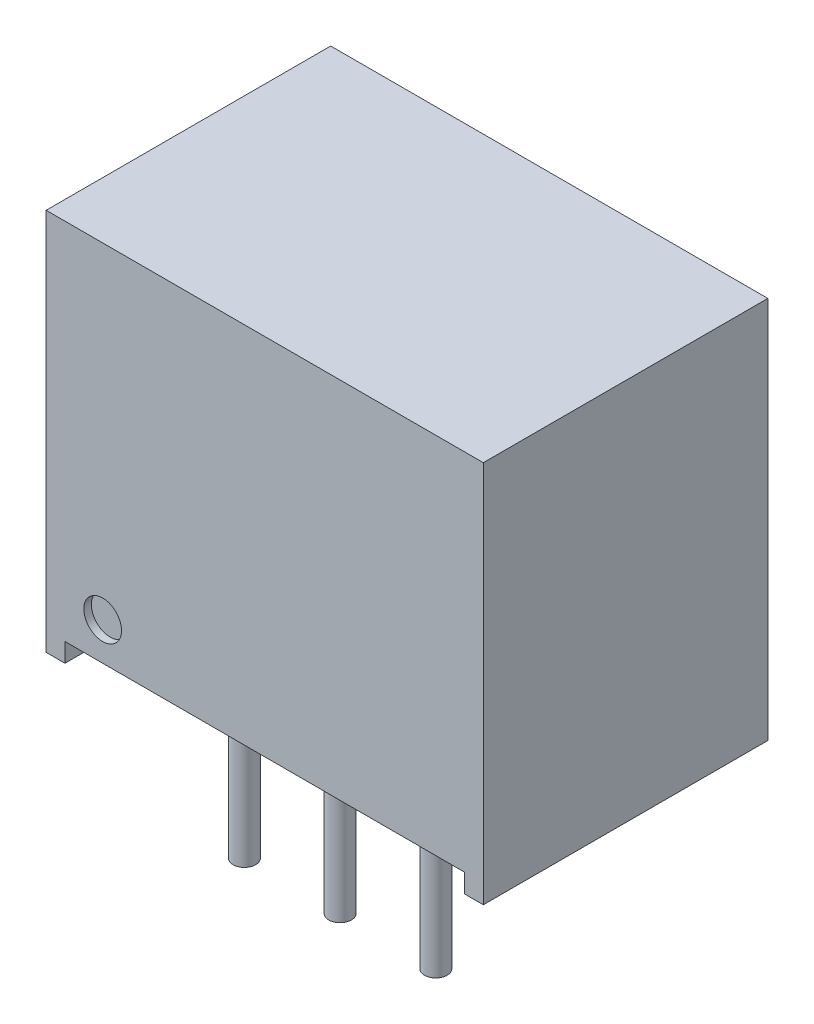
ISO-10303-21;
HEADER;
FILE_DESCRIPTION(('STEP AP214'),'2;1');
FILE_NAME('part.step','',(''),(''),'','','');
FILE_SCHEMA(('AUTOMOTIVE_DESIGN { 1 0 10303 214 1 1 1 1 }'));
ENDSEC;
DATA;
#1=APPLICATION_CONTEXT('core data for automotive mechanical design processes');
#2=APPLICATION_PROTOCOL_DEFINITION('international standard','automotive_design',2000,#1);
#3=PRODUCT_CONTEXT('',#1,'mechanical');
#4=PRODUCT('Part','Part','',(#3));
#5=PRODUCT_RELATED_PRODUCT_CATEGORY('part','',(#4));
#6=PRODUCT_DEFINITION_FORMATION('','',#4);
#7=PRODUCT_DEFINITION_CONTEXT('part definition',#1,'design');
#8=PRODUCT_DEFINITION('design','',#6,#7);
#9=PRODUCT_DEFINITION_SHAPE('','',#8);
#10=(LENGTH_UNIT() NAMED_UNIT(*) SI_UNIT(.MILLI.,.METRE.));
#11=(NAMED_UNIT(*) PLANE_ANGLE_UNIT() SI_UNIT($,.RADIAN.));
#12=(NAMED_UNIT(*) SI_UNIT($,.STERADIAN.) SOLID_ANGLE_UNIT());
#13=UNCERTAINTY_MEASURE_WITH_UNIT(LENGTH_MEASURE(1.E-05),#10,'distance_accuracy_value','');
#14=(GEOMETRIC_REPRESENTATION_CONTEXT(3) GLOBAL_UNCERTAINTY_ASSIGNED_CONTEXT((#13)) GLOBAL_UNIT_ASSIGNED_CONTEXT((#10,
#11,#12)) REPRESENTATION_CONTEXT('',''));
#15=CARTESIAN_POINT('',(0.,0.,0.));
#16=DIRECTION('',(0.,0.,1.));
#17=DIRECTION('',(1.,0.,0.));
#18=AXIS2_PLACEMENT_3D('',#15,#16,#17);
#19=CARTESIAN_POINT('',(0.,0.,0.));
#20=DIRECTION('',(0.,-1.,0.));
#21=DIRECTION('',(0.,0.,-1.));
#22=AXIS2_PLACEMENT_3D('',#19,#20,#21);
#23=PLANE('',#22);
#24=DIRECTION('',(1.,0.,0.));
#25=VECTOR('',#24,1.);
#26=CARTESIAN_POINT('',(0.,0.,0.));
#27=LINE('',#26,#25);
#28=CARTESIAN_POINT('',(11.1,0.,0.));
#29=VERTEX_POINT('',#28);
#30=CARTESIAN_POINT('',(11.6,0.,0.));
#31=VERTEX_POINT('',#30);
#32=EDGE_CURVE('E458',#29,#31,#27,.T.);
#33=ORIENTED_EDGE('',*,*,#32,.F.);
#34=DIRECTION('',(0.,0.,-1.));
#35=VECTOR('',#34,1.);
#36=CARTESIAN_POINT('',(11.1,0.,0.));
#37=LINE('',#36,#35);
#38=CARTESIAN_POINT('',(11.1,0.,-7.55));
#39=VERTEX_POINT('',#38);
#40=EDGE_CURVE('E475',#29,#39,#37,.T.);
#41=ORIENTED_EDGE('',*,*,#40,.T.);
#42=DIRECTION('',(-1.,0.,0.));
#43=VECTOR('',#42,1.);
#44=CARTESIAN_POINT('',(0.,0.,-7.55));
#45=LINE('',#44,#43);
#46=CARTESIAN_POINT('',(11.6,0.,-7.55));
#47=VERTEX_POINT('',#46);
#48=EDGE_CURVE('E425',#47,#39,#45,.T.);
#49=ORIENTED_EDGE('',*,*,#48,.F.);
#50=DIRECTION('',(0.,0.,-1.));
#51=VECTOR('',#50,1.);
#52=CARTESIAN_POINT('',(11.6,0.,0.));
#53=LINE('',#52,#51);
#54=EDGE_CURVE('E462',#31,#47,#53,.T.);
#55=ORIENTED_EDGE('',*,*,#54,.F.);
#56=EDGE_LOOP('',(#33,#41,#49,#55));
#57=FACE_BOUND('',#56,.T.);
#58=ADVANCED_FACE('F331',(#57),#23,.T.);
#59=CARTESIAN_POINT('',(0.,10.16,0.));
#60=DIRECTION('',(1.,0.,0.));
#61=DIRECTION('',(0.,0.,-1.));
#62=AXIS2_PLACEMENT_3D('',#59,#60,#61);
#63=PLANE('',#62);
#64=DIRECTION('',(0.,0.,1.));
#65=VECTOR('',#64,1.);
#66=CARTESIAN_POINT('',(0.,0.,0.));
#67=LINE('',#66,#65);
#68=CARTESIAN_POINT('',(0.,0.,-7.55));
#69=VERTEX_POINT('',#68);
#70=CARTESIAN_POINT('',(0.,0.,0.));
#71=VERTEX_POINT('',#70);
#72=EDGE_CURVE('E446',#69,#71,#67,.T.);
#73=ORIENTED_EDGE('',*,*,#72,.T.);
#74=DIRECTION('',(0.,-1.,0.));
#75=VECTOR('',#74,1.);
#76=CARTESIAN_POINT('',(0.,10.16,0.));
#77=LINE('',#76,#75);
#78=CARTESIAN_POINT('',(0.,10.16,0.));
#79=VERTEX_POINT('',#78);
#80=EDGE_CURVE('E12',#79,#71,#77,.T.);
#81=ORIENTED_EDGE('',*,*,#80,.F.);
#82=DIRECTION('',(0.,0.,1.));
#83=VECTOR('',#82,1.);
#84=CARTESIAN_POINT('',(0.,10.16,0.));
#85=LINE('',#84,#83);
#86=CARTESIAN_POINT('',(0.,10.16,-7.55));
#87=VERTEX_POINT('',#86);
#88=EDGE_CURVE('E449',#87,#79,#85,.T.);
#89=ORIENTED_EDGE('',*,*,#88,.F.);
#90=DIRECTION('',(0.,-1.,0.));
#91=VECTOR('',#90,1.);
#92=CARTESIAN_POINT('',(0.,10.16,-7.55));
#93=LINE('',#92,#91);
#94=EDGE_CURVE('E455',#87,#69,#93,.T.);
#95=ORIENTED_EDGE('',*,*,#94,.T.);
#96=EDGE_LOOP('',(#73,#81,#89,#95));
#97=FACE_BOUND('',#96,.T.);
#98=ADVANCED_FACE('F333',(#97),#63,.F.);
#99=CARTESIAN_POINT('',(0.,10.16,0.));
#100=DIRECTION('',(0.,0.,-1.));
#101=DIRECTION('',(-1.,0.,0.));
#102=AXIS2_PLACEMENT_3D('',#99,#100,#101);
#103=PLANE('',#102);
#104=CARTESIAN_POINT('',(1.5,1.5,0.));
#105=DIRECTION('',(0.,0.,1.));
#106=DIRECTION('',(1.,0.,0.));
#107=AXIS2_PLACEMENT_3D('',#104,#105,#106);
#108=CIRCLE('',#107,0.5);
#109=CARTESIAN_POINT('',(2.,1.5,0.));
#110=VERTEX_POINT('',#109);
#111=EDGE_CURVE('E442',#110,#110,#108,.T.);
#112=ORIENTED_EDGE('',*,*,#111,.F.);
#113=EDGE_LOOP('',(#112));
#114=FACE_BOUND('',#113,.T.);
#115=CARTESIAN_POINT('',(0.500000000000001,0.,0.));
#116=VERTEX_POINT('',#115);
#117=EDGE_CURVE('E459',#71,#116,#27,.T.);
#118=ORIENTED_EDGE('',*,*,#117,.T.);
#119=DIRECTION('',(0.,-1.,0.));
#120=VECTOR('',#119,1.);
#121=CARTESIAN_POINT('',(0.500000000000001,0.5,0.));
#122=LINE('',#121,#120);
#123=CARTESIAN_POINT('',(0.500000000000001,0.5,0.));
#124=VERTEX_POINT('',#123);
#125=EDGE_CURVE('E427',#124,#116,#122,.T.);
#126=ORIENTED_EDGE('',*,*,#125,.F.);
#127=DIRECTION('',(-1.,0.,0.));
#128=VECTOR('',#127,1.);
#129=CARTESIAN_POINT('',(0.,0.5,0.));
#130=LINE('',#129,#128);
#131=CARTESIAN_POINT('',(11.1,0.5,0.));
#132=VERTEX_POINT('',#131);
#133=EDGE_CURVE('E410',#132,#124,#130,.T.);
#134=ORIENTED_EDGE('',*,*,#133,.F.);
#135=DIRECTION('',(0.,-1.,0.));
#136=VECTOR('',#135,1.);
#137=CARTESIAN_POINT('',(11.1,0.5,0.));
#138=LINE('',#137,#136);
#139=EDGE_CURVE('E407',#132,#29,#138,.T.);
#140=ORIENTED_EDGE('',*,*,#139,.T.);
#141=ORIENTED_EDGE('',*,*,#32,.T.);
#142=DIRECTION('',(0.,-1.,0.));
#143=VECTOR('',#142,1.);
#144=CARTESIAN_POINT('',(11.6,10.16,0.));
#145=LINE('',#144,#143);
#146=CARTESIAN_POINT('',(11.6,10.16,0.));
#147=VERTEX_POINT('',#146);
#148=EDGE_CURVE('E339',#147,#31,#145,.T.);
#149=ORIENTED_EDGE('',*,*,#148,.F.);
#150=DIRECTION('',(1.,0.,0.));
#151=VECTOR('',#150,1.);
#152=CARTESIAN_POINT('',(0.,10.16,0.));
#153=LINE('',#152,#151);
#154=EDGE_CURVE('E383',#79,#147,#153,.T.);
#155=ORIENTED_EDGE('',*,*,#154,.F.);
#156=ORIENTED_EDGE('',*,*,#80,.T.);
#157=EDGE_LOOP('',(#118,#126,#134,#140,#141,#149,#155,#156));
#158=FACE_BOUND('',#157,.T.);
#159=ADVANCED_FACE('F491',(#114,#158),#103,.F.);
#160=CARTESIAN_POINT('',(11.6,10.16,0.));
#161=DIRECTION('',(-1.,0.,0.));
#162=DIRECTION('',(0.,0.,1.));
#163=AXIS2_PLACEMENT_3D('',#160,#161,#162);
#164=PLANE('',#163);
#165=ORIENTED_EDGE('',*,*,#54,.T.);
#166=DIRECTION('',(0.,-1.,0.));
#167=VECTOR('',#166,1.);
#168=CARTESIAN_POINT('',(11.6,10.16,-7.55));
#169=LINE('',#168,#167);
#170=CARTESIAN_POINT('',(11.6,10.16,-7.55));
#171=VERTEX_POINT('',#170);
#172=EDGE_CURVE('E466',#171,#47,#169,.T.);
#173=ORIENTED_EDGE('',*,*,#172,.F.);
#174=DIRECTION('',(0.,0.,-1.));
#175=VECTOR('',#174,1.);
#176=CARTESIAN_POINT('',(11.6,10.16,0.));
#177=LINE('',#176,#175);
#178=EDGE_CURVE('E452',#147,#171,#177,.T.);
#179=ORIENTED_EDGE('',*,*,#178,.F.);
#180=ORIENTED_EDGE('',*,*,#148,.T.);
#181=EDGE_LOOP('',(#165,#173,#179,#180));
#182=FACE_BOUND('',#181,.T.);
#183=ADVANCED_FACE('F471',(#182),#164,.F.);
#184=CARTESIAN_POINT('',(0.,10.16,-7.55));
#185=DIRECTION('',(0.,0.,1.));
#186=DIRECTION('',(1.,0.,0.));
#187=AXIS2_PLACEMENT_3D('',#184,#185,#186);
#188=PLANE('',#187);
#189=DIRECTION('',(1.,0.,0.));
#190=VECTOR('',#189,1.);
#191=CARTESIAN_POINT('',(0.,0.5,-7.55));
#192=LINE('',#191,#190);
#193=CARTESIAN_POINT('',(0.500000000000001,0.5,-7.55));
#194=VERTEX_POINT('',#193);
#195=CARTESIAN_POINT('',(11.1,0.5,-7.55));
#196=VERTEX_POINT('',#195);
#197=EDGE_CURVE('E411',#194,#196,#192,.T.);
#198=ORIENTED_EDGE('',*,*,#197,.F.);
#199=DIRECTION('',(0.,-1.,0.));
#200=VECTOR('',#199,1.);
#201=CARTESIAN_POINT('',(0.500000000000001,0.5,-7.55));
#202=LINE('',#201,#200);
#203=CARTESIAN_POINT('',(0.500000000000001,0.,-7.55));
#204=VERTEX_POINT('',#203);
#205=EDGE_CURVE('E436',#194,#204,#202,.T.);
#206=ORIENTED_EDGE('',*,*,#205,.T.);
#207=EDGE_CURVE('E376',#204,#69,#45,.T.);
#208=ORIENTED_EDGE('',*,*,#207,.T.);
#209=ORIENTED_EDGE('',*,*,#94,.F.);
#210=DIRECTION('',(-1.,0.,0.));
#211=VECTOR('',#210,1.);
#212=CARTESIAN_POINT('',(0.,10.16,-7.55));
#213=LINE('',#212,#211);
#214=EDGE_CURVE('E355',#171,#87,#213,.T.);
#215=ORIENTED_EDGE('',*,*,#214,.F.);
#216=ORIENTED_EDGE('',*,*,#172,.T.);
#217=ORIENTED_EDGE('',*,*,#48,.T.);
#218=DIRECTION('',(0.,-1.,0.));
#219=VECTOR('',#218,1.);
#220=CARTESIAN_POINT('',(11.1,0.5,-7.55));
#221=LINE('',#220,#219);
#222=EDGE_CURVE('E346',#196,#39,#221,.T.);
#223=ORIENTED_EDGE('',*,*,#222,.F.);
#224=EDGE_LOOP('',(#198,#206,#208,#209,#215,#216,#217,#223));
#225=FACE_BOUND('',#224,.T.);
#226=ADVANCED_FACE('F422',(#225),#188,.F.);
#227=CARTESIAN_POINT('',(0.,10.16,0.));
#228=DIRECTION('',(0.,-1.,0.));
#229=DIRECTION('',(0.,0.,-1.));
#230=AXIS2_PLACEMENT_3D('',#227,#228,#229);
#231=PLANE('',#230);
#232=ORIENTED_EDGE('',*,*,#88,.T.);
#233=ORIENTED_EDGE('',*,*,#154,.T.);
#234=ORIENTED_EDGE('',*,*,#178,.T.);
#235=ORIENTED_EDGE('',*,*,#214,.T.);
#236=EDGE_LOOP('',(#232,#233,#234,#235));
#237=FACE_BOUND('',#236,.T.);
#238=ADVANCED_FACE('F495',(#237),#231,.F.);
#239=DIRECTION('',(0.,0.,-1.));
#240=VECTOR('',#239,1.);
#241=CARTESIAN_POINT('',(0.5,0.,0.));
#242=LINE('',#241,#240);
#243=EDGE_CURVE('E419',#116,#204,#242,.T.);
#244=ORIENTED_EDGE('',*,*,#243,.F.);
#245=ORIENTED_EDGE('',*,*,#117,.F.);
#246=ORIENTED_EDGE('',*,*,#72,.F.);
#247=ORIENTED_EDGE('',*,*,#207,.F.);
#248=EDGE_LOOP('',(#244,#245,#246,#247));
#249=FACE_BOUND('',#248,.T.);
#250=ADVANCED_FACE('F489',(#249),#23,.T.);
#251=CARTESIAN_POINT('',(1.5,1.5,-0.2));
#252=DIRECTION('',(0.,0.,1.));
#253=DIRECTION('',(1.,0.,0.));
#254=AXIS2_PLACEMENT_3D('',#251,#252,#253);
#255=CYLINDRICAL_SURFACE('',#254,0.5);
#256=CARTESIAN_POINT('',(1.5,1.5,-0.2));
#257=DIRECTION('',(0.,0.,1.));
#258=DIRECTION('',(1.,0.,0.));
#259=AXIS2_PLACEMENT_3D('',#256,#257,#258);
#260=CIRCLE('',#259,0.5);
#261=CARTESIAN_POINT('',(2.,1.5,-0.2));
#262=VERTEX_POINT('',#261);
#263=EDGE_CURVE('E443',#262,#262,#260,.T.);
#264=ORIENTED_EDGE('',*,*,#263,.F.);
#265=EDGE_LOOP('',(#264));
#266=FACE_BOUND('',#265,.T.);
#267=ORIENTED_EDGE('',*,*,#111,.T.);
#268=EDGE_LOOP('',(#267));
#269=FACE_BOUND('',#268,.T.);
#270=ADVANCED_FACE('F502',(#266,#269),#255,.F.);
#271=CARTESIAN_POINT('',(1.5,1.5,-0.2));
#272=DIRECTION('',(0.,0.,1.));
#273=DIRECTION('',(1.,0.,0.));
#274=AXIS2_PLACEMENT_3D('',#271,#272,#273);
#275=PLANE('',#274);
#276=ORIENTED_EDGE('',*,*,#263,.T.);
#277=EDGE_LOOP('',(#276));
#278=FACE_BOUND('',#277,.T.);
#279=ADVANCED_FACE('F519',(#278),#275,.T.);
#280=CARTESIAN_POINT('',(0.,0.5,0.));
#281=DIRECTION('',(0.,1.,0.));
#282=DIRECTION('',(0.,0.,1.));
#283=AXIS2_PLACEMENT_3D('',#280,#281,#282);
#284=PLANE('',#283);
#285=CARTESIAN_POINT('',(5.8,0.5,-2.));
#286=DIRECTION('',(0.,-1.,0.));
#287=DIRECTION('',(0.,0.,-1.));
#288=AXIS2_PLACEMENT_3D('',#285,#286,#287);
#289=CIRCLE('',#288,0.3);
#290=CARTESIAN_POINT('',(5.8,0.5,-2.3));
#291=VERTEX_POINT('',#290);
#292=EDGE_CURVE('E480',#291,#291,#289,.F.);
#293=ORIENTED_EDGE('',*,*,#292,.T.);
#294=EDGE_LOOP('',(#293));
#295=FACE_BOUND('',#294,.T.);
#296=ORIENTED_EDGE('',*,*,#197,.T.);
#297=DIRECTION('',(0.,0.,-1.));
#298=VECTOR('',#297,1.);
#299=CARTESIAN_POINT('',(11.1,0.5,0.));
#300=LINE('',#299,#298);
#301=EDGE_CURVE('E403',#132,#196,#300,.T.);
#302=ORIENTED_EDGE('',*,*,#301,.F.);
#303=ORIENTED_EDGE('',*,*,#133,.T.);
#304=DIRECTION('',(0.,0.,-1.));
#305=VECTOR('',#304,1.);
#306=CARTESIAN_POINT('',(0.5,0.5,0.));
#307=LINE('',#306,#305);
#308=EDGE_CURVE('E418',#124,#194,#307,.T.);
#309=ORIENTED_EDGE('',*,*,#308,.T.);
#310=EDGE_LOOP('',(#296,#302,#303,#309));
#311=FACE_BOUND('',#310,.T.);
#312=CARTESIAN_POINT('',(8.34,0.5,-2.));
#313=DIRECTION('',(0.,-1.,0.));
#314=DIRECTION('',(0.,0.,-1.));
#315=AXIS2_PLACEMENT_3D('',#312,#313,#314);
#316=CIRCLE('',#315,0.3);
#317=CARTESIAN_POINT('',(8.34,0.5,-2.3));
#318=VERTEX_POINT('',#317);
#319=EDGE_CURVE('E476',#318,#318,#316,.F.);
#320=ORIENTED_EDGE('',*,*,#319,.T.);
#321=EDGE_LOOP('',(#320));
#322=FACE_BOUND('',#321,.T.);
#323=CARTESIAN_POINT('',(3.26,0.5,-2.));
#324=DIRECTION('',(0.,-1.,0.));
#325=DIRECTION('',(0.,0.,-1.));
#326=AXIS2_PLACEMENT_3D('',#323,#324,#325);
#327=CIRCLE('',#326,0.300000000000006);
#328=CARTESIAN_POINT('',(3.26,0.5,-2.30000000000001));
#329=VERTEX_POINT('',#328);
#330=EDGE_CURVE('E563',#329,#329,#327,.F.);
#331=ORIENTED_EDGE('',*,*,#330,.T.);
#332=EDGE_LOOP('',(#331));
#333=FACE_BOUND('',#332,.T.);
#334=ADVANCED_FACE('F415',(#295,#311,#322,#333),#284,.F.);
#335=CARTESIAN_POINT('',(0.5,0.5,0.));
#336=DIRECTION('',(-1.,0.,0.));
#337=DIRECTION('',(0.,0.,1.));
#338=AXIS2_PLACEMENT_3D('',#335,#336,#337);
#339=PLANE('',#338);
#340=ORIENTED_EDGE('',*,*,#243,.T.);
#341=ORIENTED_EDGE('',*,*,#205,.F.);
#342=ORIENTED_EDGE('',*,*,#308,.F.);
#343=ORIENTED_EDGE('',*,*,#125,.T.);
#344=EDGE_LOOP('',(#340,#341,#342,#343));
#345=FACE_BOUND('',#344,.T.);
#346=ADVANCED_FACE('F487',(#345),#339,.F.);
#347=CARTESIAN_POINT('',(11.1,0.5,0.));
#348=DIRECTION('',(-1.,0.,0.));
#349=DIRECTION('',(0.,0.,1.));
#350=AXIS2_PLACEMENT_3D('',#347,#348,#349);
#351=PLANE('',#350);
#352=ORIENTED_EDGE('',*,*,#40,.F.);
#353=ORIENTED_EDGE('',*,*,#139,.F.);
#354=ORIENTED_EDGE('',*,*,#301,.T.);
#355=ORIENTED_EDGE('',*,*,#222,.T.);
#356=EDGE_LOOP('',(#352,#353,#354,#355));
#357=FACE_BOUND('',#356,.T.);
#358=ADVANCED_FACE('F405',(#357),#351,.T.);
#359=CARTESIAN_POINT('',(8.34,-4.1,-2.));
#360=DIRECTION('',(0.,-1.,0.));
#361=DIRECTION('',(0.,0.,-1.));
#362=AXIS2_PLACEMENT_3D('',#359,#360,#361);
#363=PLANE('',#362);
#364=CARTESIAN_POINT('',(8.34,-4.1,-2.));
#365=DIRECTION('',(0.,-1.,0.));
#366=DIRECTION('',(0.,0.,-1.));
#367=AXIS2_PLACEMENT_3D('',#364,#365,#366);
#368=CIRCLE('',#367,0.3);
#369=CARTESIAN_POINT('',(8.34,-4.1,-2.3));
#370=VERTEX_POINT('',#369);
#371=EDGE_CURVE('E435',#370,#370,#368,.T.);
#372=ORIENTED_EDGE('',*,*,#371,.T.);
#373=EDGE_LOOP('',(#372));
#374=FACE_BOUND('',#373,.T.);
#375=ADVANCED_FACE('F540',(#374),#363,.T.);
#376=CARTESIAN_POINT('',(8.34,-4.1,-2.));
#377=DIRECTION('',(0.,1.,0.));
#378=DIRECTION('',(0.,0.,1.));
#379=AXIS2_PLACEMENT_3D('',#376,#377,#378);
#380=CYLINDRICAL_SURFACE('',#379,0.3);
#381=ORIENTED_EDGE('',*,*,#371,.F.);
#382=EDGE_LOOP('',(#381));
#383=FACE_BOUND('',#382,.T.);
#384=ORIENTED_EDGE('',*,*,#319,.F.);
#385=EDGE_LOOP('',(#384));
#386=FACE_BOUND('',#385,.T.);
#387=ADVANCED_FACE('F536',(#383,#386),#380,.T.);
#388=CARTESIAN_POINT('',(5.8,-4.1,-2.));
#389=DIRECTION('',(0.,-1.,0.));
#390=DIRECTION('',(0.,0.,-1.));
#391=AXIS2_PLACEMENT_3D('',#388,#389,#390);
#392=PLANE('',#391);
#393=CARTESIAN_POINT('',(5.8,-4.1,-2.));
#394=DIRECTION('',(0.,-1.,0.));
#395=DIRECTION('',(0.,0.,-1.));
#396=AXIS2_PLACEMENT_3D('',#393,#394,#395);
#397=CIRCLE('',#396,0.3);
#398=CARTESIAN_POINT('',(5.8,-4.1,-2.3));
#399=VERTEX_POINT('',#398);
#400=EDGE_CURVE('E439',#399,#399,#397,.T.);
#401=ORIENTED_EDGE('',*,*,#400,.T.);
#402=EDGE_LOOP('',(#401));
#403=FACE_BOUND('',#402,.T.);
#404=ADVANCED_FACE('F532',(#403),#392,.T.);
#405=CARTESIAN_POINT('',(5.8,-4.1,-2.));
#406=DIRECTION('',(0.,1.,0.));
#407=DIRECTION('',(0.,0.,1.));
#408=AXIS2_PLACEMENT_3D('',#405,#406,#407);
#409=CYLINDRICAL_SURFACE('',#408,0.3);
#410=ORIENTED_EDGE('',*,*,#400,.F.);
#411=EDGE_LOOP('',(#410));
#412=FACE_BOUND('',#411,.T.);
#413=ORIENTED_EDGE('',*,*,#292,.F.);
#414=EDGE_LOOP('',(#413));
#415=FACE_BOUND('',#414,.T.);
#416=ADVANCED_FACE('F528',(#412,#415),#409,.T.);
#417=CARTESIAN_POINT('',(3.26,-4.1,-2.));
#418=DIRECTION('',(0.,-1.,0.));
#419=DIRECTION('',(0.,0.,-1.));
#420=AXIS2_PLACEMENT_3D('',#417,#418,#419);
#421=PLANE('',#420);
#422=CARTESIAN_POINT('',(3.26,-4.1,-2.));
#423=DIRECTION('',(0.,-1.,0.));
#424=DIRECTION('',(0.,0.,-1.));
#425=AXIS2_PLACEMENT_3D('',#422,#423,#424);
#426=CIRCLE('',#425,0.300000000000006);
#427=CARTESIAN_POINT('',(3.26,-4.1,-2.30000000000001));
#428=VERTEX_POINT('',#427);
#429=EDGE_CURVE('E432',#428,#428,#426,.T.);
#430=ORIENTED_EDGE('',*,*,#429,.T.);
#431=EDGE_LOOP('',(#430));
#432=FACE_BOUND('',#431,.T.);
#433=ADVANCED_FACE('F531',(#432),#421,.T.);
#434=CARTESIAN_POINT('',(3.26,-4.1,-2.));
#435=DIRECTION('',(0.,1.,0.));
#436=DIRECTION('',(0.,0.,1.));
#437=AXIS2_PLACEMENT_3D('',#434,#435,#436);
#438=CYLINDRICAL_SURFACE('',#437,0.300000000000006);
#439=ORIENTED_EDGE('',*,*,#429,.F.);
#440=EDGE_LOOP('',(#439));
#441=FACE_BOUND('',#440,.T.);
#442=ORIENTED_EDGE('',*,*,#330,.F.);
#443=EDGE_LOOP('',(#442));
#444=FACE_BOUND('',#443,.T.);
#445=ADVANCED_FACE('F545',(#441,#444),#438,.T.);
#446=CLOSED_SHELL('',(#58,#98,#159,#183,#226,#238,#250,#270,#279,#334,#346,#358,#375,#387,#404,
#416,#433,#445));
#447=MANIFOLD_SOLID_BREP('B2',#446);
#448=ADVANCED_BREP_SHAPE_REPRESENTATION('',(#18,#447),#14);
#449=SHAPE_DEFINITION_REPRESENTATION(#9,#448);
ENDSEC;
END-ISO-10303-21;
